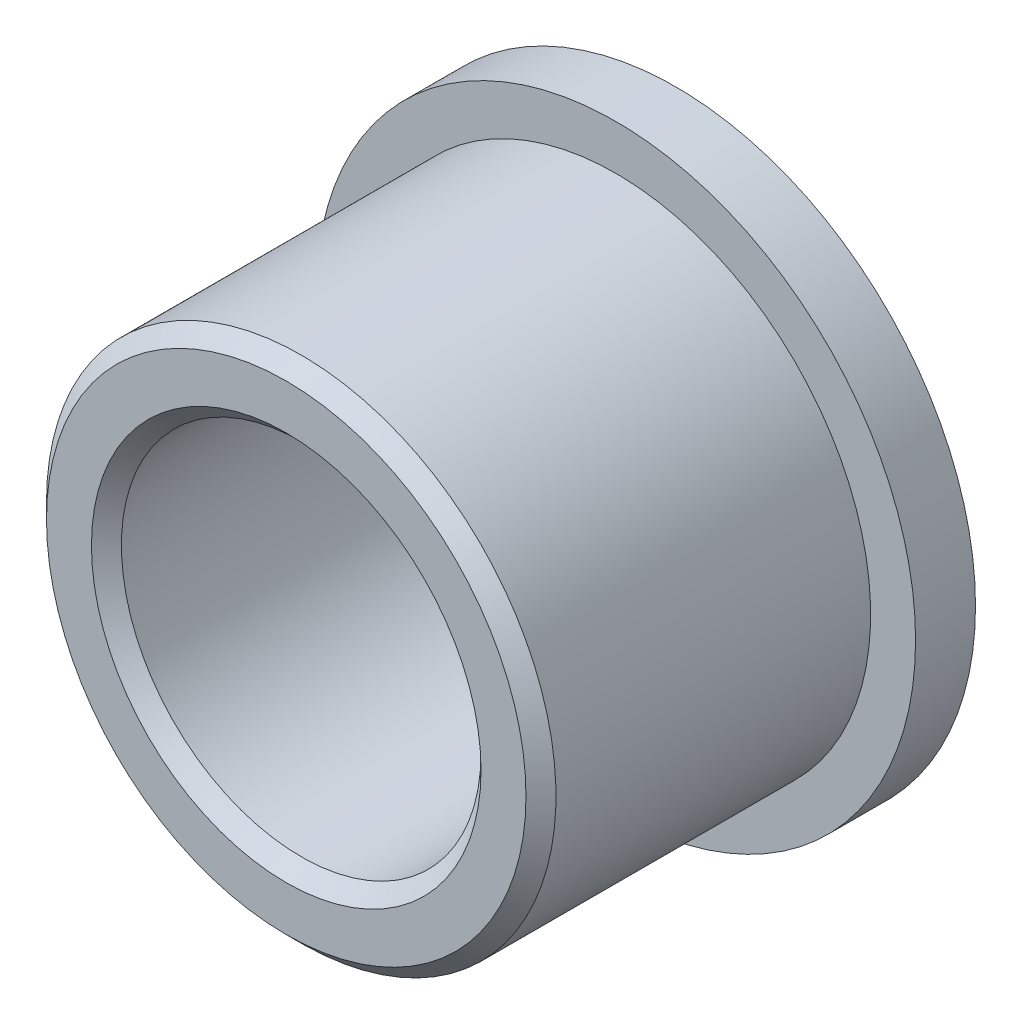
ISO-10303-21;
HEADER;
FILE_DESCRIPTION(('STEP AP214'),'2;1');
FILE_NAME('part.step','',(''),(''),'','','');
FILE_SCHEMA(('AUTOMOTIVE_DESIGN { 1 0 10303 214 1 1 1 1 }'));
ENDSEC;
DATA;
#1=APPLICATION_CONTEXT('core data for automotive mechanical design processes');
#2=APPLICATION_PROTOCOL_DEFINITION('international standard','automotive_design',2000,#1);
#3=PRODUCT_CONTEXT('',#1,'mechanical');
#4=PRODUCT('Part','Part','',(#3));
#5=PRODUCT_RELATED_PRODUCT_CATEGORY('part','',(#4));
#6=PRODUCT_DEFINITION_FORMATION('','',#4);
#7=PRODUCT_DEFINITION_CONTEXT('part definition',#1,'design');
#8=PRODUCT_DEFINITION('design','',#6,#7);
#9=PRODUCT_DEFINITION_SHAPE('','',#8);
#10=(LENGTH_UNIT() NAMED_UNIT(*) SI_UNIT(.MILLI.,.METRE.));
#11=(NAMED_UNIT(*) PLANE_ANGLE_UNIT() SI_UNIT($,.RADIAN.));
#12=(NAMED_UNIT(*) SI_UNIT($,.STERADIAN.) SOLID_ANGLE_UNIT());
#13=UNCERTAINTY_MEASURE_WITH_UNIT(LENGTH_MEASURE(1.E-05),#10,'distance_accuracy_value','');
#14=(GEOMETRIC_REPRESENTATION_CONTEXT(3) GLOBAL_UNCERTAINTY_ASSIGNED_CONTEXT((#13)) GLOBAL_UNIT_ASSIGNED_CONTEXT((#10,
#11,#12)) REPRESENTATION_CONTEXT('',''));
#15=CARTESIAN_POINT('',(0.,0.,0.));
#16=DIRECTION('',(0.,0.,1.));
#17=DIRECTION('',(1.,0.,0.));
#18=AXIS2_PLACEMENT_3D('',#15,#16,#17);
#19=CARTESIAN_POINT('',(0.,0.,2.));
#20=DIRECTION('',(0.,0.,-1.));
#21=DIRECTION('',(-1.,0.,0.));
#22=AXIS2_PLACEMENT_3D('',#19,#20,#21);
#23=CYLINDRICAL_SURFACE('',#22,10.);
#24=CARTESIAN_POINT('',(0.,0.,2.));
#25=DIRECTION('',(0.,0.,1.));
#26=DIRECTION('',(1.,0.,0.));
#27=AXIS2_PLACEMENT_3D('',#24,#25,#26);
#28=CIRCLE('',#27,10.);
#29=CARTESIAN_POINT('',(10.,0.,2.));
#30=VERTEX_POINT('',#29);
#31=EDGE_CURVE('E80',#30,#30,#28,.T.);
#32=ORIENTED_EDGE('',*,*,#31,.F.);
#33=EDGE_LOOP('',(#32));
#34=FACE_BOUND('',#33,.T.);
#35=CARTESIAN_POINT('',(0.,0.,0.));
#36=DIRECTION('',(0.,0.,1.));
#37=DIRECTION('',(1.,0.,0.));
#38=AXIS2_PLACEMENT_3D('',#35,#36,#37);
#39=CIRCLE('',#38,10.);
#40=CARTESIAN_POINT('',(10.,0.,0.));
#41=VERTEX_POINT('',#40);
#42=EDGE_CURVE('E81',#41,#41,#39,.T.);
#43=ORIENTED_EDGE('',*,*,#42,.T.);
#44=EDGE_LOOP('',(#43));
#45=FACE_BOUND('',#44,.T.);
#46=ADVANCED_FACE('F47',(#34,#45),#23,.T.);
#47=CARTESIAN_POINT('',(0.,0.,2.));
#48=DIRECTION('',(0.,0.,1.));
#49=DIRECTION('',(1.,0.,0.));
#50=AXIS2_PLACEMENT_3D('',#47,#48,#49);
#51=PLANE('',#50);
#52=CARTESIAN_POINT('',(0.,0.,2.));
#53=DIRECTION('',(0.,0.,1.));
#54=DIRECTION('',(1.,0.,0.));
#55=AXIS2_PLACEMENT_3D('',#52,#53,#54);
#56=CIRCLE('',#55,8.5);
#57=CARTESIAN_POINT('',(-8.5,0.,2.));
#58=VERTEX_POINT('',#57);
#59=EDGE_CURVE('E85',#58,#58,#56,.F.);
#60=ORIENTED_EDGE('',*,*,#59,.T.);
#61=EDGE_LOOP('',(#60));
#62=FACE_BOUND('',#61,.T.);
#63=ORIENTED_EDGE('',*,*,#31,.T.);
#64=EDGE_LOOP('',(#63));
#65=FACE_BOUND('',#64,.T.);
#66=ADVANCED_FACE('F93',(#62,#65),#51,.T.);
#67=CARTESIAN_POINT('',(0.,0.,0.));
#68=DIRECTION('',(0.,0.,1.));
#69=DIRECTION('',(1.,0.,0.));
#70=AXIS2_PLACEMENT_3D('',#67,#68,#69);
#71=PLANE('',#70);
#72=CARTESIAN_POINT('',(0.,0.,0.));
#73=DIRECTION('',(0.,0.,1.));
#74=DIRECTION('',(1.,0.,0.));
#75=AXIS2_PLACEMENT_3D('',#72,#73,#74);
#76=CIRCLE('',#75,6.49999999999999);
#77=CARTESIAN_POINT('',(6.49999999999999,0.,0.));
#78=VERTEX_POINT('',#77);
#79=EDGE_CURVE('E56',#78,#78,#76,.T.);
#80=ORIENTED_EDGE('',*,*,#79,.T.);
#81=EDGE_LOOP('',(#80));
#82=FACE_BOUND('',#81,.T.);
#83=ORIENTED_EDGE('',*,*,#42,.F.);
#84=EDGE_LOOP('',(#83));
#85=FACE_BOUND('',#84,.T.);
#86=ADVANCED_FACE('F99',(#82,#85),#71,.F.);
#87=CARTESIAN_POINT('',(0.,0.,13.));
#88=DIRECTION('',(0.,0.,-1.));
#89=DIRECTION('',(-1.,0.,0.));
#90=AXIS2_PLACEMENT_3D('',#87,#88,#89);
#91=CYLINDRICAL_SURFACE('',#90,8.5);
#92=CARTESIAN_POINT('',(0.,0.,12.5));
#93=DIRECTION('',(0.,0.,1.));
#94=DIRECTION('',(1.,0.,0.));
#95=AXIS2_PLACEMENT_3D('',#92,#93,#94);
#96=CIRCLE('',#95,8.5);
#97=CARTESIAN_POINT('',(-8.5,0.,12.5));
#98=VERTEX_POINT('',#97);
#99=EDGE_CURVE('E10',#98,#98,#96,.F.);
#100=CARTESIAN_POINT('',(-8.5,0.,12.5));
#101=CARTESIAN_POINT('',(-8.5,0.,12.390625));
#102=CARTESIAN_POINT('',(-8.5,0.,12.28125));
#103=CARTESIAN_POINT('',(-8.5,0.,12.0625));
#104=CARTESIAN_POINT('',(-8.5,0.,11.953125));
#105=CARTESIAN_POINT('',(-8.5,0.,11.734375));
#106=CARTESIAN_POINT('',(-8.5,0.,11.625));
#107=CARTESIAN_POINT('',(-8.5,0.,11.40625));
#108=CARTESIAN_POINT('',(-8.5,0.,11.296875));
#109=CARTESIAN_POINT('',(-8.5,0.,11.078125));
#110=CARTESIAN_POINT('',(-8.5,0.,10.96875));
#111=CARTESIAN_POINT('',(-8.5,0.,10.75));
#112=CARTESIAN_POINT('',(-8.5,0.,10.640625));
#113=CARTESIAN_POINT('',(-8.5,0.,10.421875));
#114=CARTESIAN_POINT('',(-8.5,0.,10.3125));
#115=CARTESIAN_POINT('',(-8.5,0.,10.09375));
#116=CARTESIAN_POINT('',(-8.5,0.,9.98437500000001));
#117=CARTESIAN_POINT('',(-8.5,0.,9.76562500000001));
#118=CARTESIAN_POINT('',(-8.5,0.,9.65625000000001));
#119=CARTESIAN_POINT('',(-8.5,0.,9.43750000000001));
#120=CARTESIAN_POINT('',(-8.5,0.,9.32812500000001));
#121=CARTESIAN_POINT('',(-8.5,0.,9.10937500000001));
#122=CARTESIAN_POINT('',(-8.5,0.,9.00000000000001));
#123=CARTESIAN_POINT('',(-8.5,0.,8.78125000000001));
#124=CARTESIAN_POINT('',(-8.5,0.,8.67187500000001));
#125=CARTESIAN_POINT('',(-8.5,0.,8.45312500000001));
#126=CARTESIAN_POINT('',(-8.5,0.,8.34375000000001));
#127=CARTESIAN_POINT('',(-8.5,0.,8.12500000000001));
#128=CARTESIAN_POINT('',(-8.5,0.,8.01562500000001));
#129=CARTESIAN_POINT('',(-8.5,0.,7.79687500000001));
#130=CARTESIAN_POINT('',(-8.5,0.,7.68750000000001));
#131=CARTESIAN_POINT('',(-8.5,0.,7.46875000000001));
#132=CARTESIAN_POINT('',(-8.5,0.,7.35937500000001));
#133=CARTESIAN_POINT('',(-8.5,0.,7.14062500000001));
#134=CARTESIAN_POINT('',(-8.5,0.,7.03125000000001));
#135=CARTESIAN_POINT('',(-8.5,0.,6.81250000000001));
#136=CARTESIAN_POINT('',(-8.5,0.,6.70312500000001));
#137=CARTESIAN_POINT('',(-8.5,0.,6.48437500000001));
#138=CARTESIAN_POINT('',(-8.5,0.,6.375));
#139=CARTESIAN_POINT('',(-8.5,0.,6.15625));
#140=CARTESIAN_POINT('',(-8.5,0.,6.046875));
#141=CARTESIAN_POINT('',(-8.5,0.,5.828125));
#142=CARTESIAN_POINT('',(-8.5,0.,5.71875));
#143=CARTESIAN_POINT('',(-8.5,0.,5.5));
#144=CARTESIAN_POINT('',(-8.5,0.,5.390625));
#145=CARTESIAN_POINT('',(-8.5,0.,5.171875));
#146=CARTESIAN_POINT('',(-8.5,0.,5.0625));
#147=CARTESIAN_POINT('',(-8.5,0.,4.84375));
#148=CARTESIAN_POINT('',(-8.5,0.,4.734375));
#149=CARTESIAN_POINT('',(-8.5,0.,4.515625));
#150=CARTESIAN_POINT('',(-8.5,0.,4.40625));
#151=CARTESIAN_POINT('',(-8.5,0.,4.1875));
#152=CARTESIAN_POINT('',(-8.5,0.,4.078125));
#153=CARTESIAN_POINT('',(-8.5,0.,3.859375));
#154=CARTESIAN_POINT('',(-8.5,0.,3.75));
#155=CARTESIAN_POINT('',(-8.5,0.,3.53125));
#156=CARTESIAN_POINT('',(-8.5,0.,3.421875));
#157=CARTESIAN_POINT('',(-8.5,0.,3.203125));
#158=CARTESIAN_POINT('',(-8.5,0.,3.09375));
#159=CARTESIAN_POINT('',(-8.5,0.,2.875));
#160=CARTESIAN_POINT('',(-8.5,0.,2.765625));
#161=CARTESIAN_POINT('',(-8.5,0.,2.546875));
#162=CARTESIAN_POINT('',(-8.5,0.,2.4375));
#163=CARTESIAN_POINT('',(-8.5,0.,2.21875));
#164=CARTESIAN_POINT('',(-8.5,0.,2.109375));
#165=CARTESIAN_POINT('',(-8.5,0.,2.));
#166=B_SPLINE_CURVE_WITH_KNOTS('',3,(#100,#101,#102,#103,#104,#105,#106,#107,#108,#109,#110,
#111,#112,#113,#114,#115,#116,#117,#118,#119,#120,#121,#122,#123,#124,#125,#126,#127,#128,#129,
#130,#131,#132,#133,#134,#135,#136,#137,#138,#139,#140,#141,#142,#143,#144,#145,#146,#147,#148,
#149,#150,#151,#152,#153,#154,#155,#156,#157,#158,#159,#160,#161,#162,#163,#164,#165),
.UNSPECIFIED.,.F.,.F.,(4,2,2,2,2,2,2,2,2,2,2,2,2,2,2,2,2,2,2,2,2,2,2,2,2,2,2,2,2,2,2,2,4),(0.,
0.328125,0.656250000000001,0.984375000000001,1.3125,1.640625,1.96875,2.296875,2.625,2.953125,
3.28125,3.609375,3.93750000000001,4.265625,4.59375000000001,4.92187500000001,5.25000000000001,
5.57812500000001,5.90625000000001,6.23437500000001,6.56250000000001,6.89062500000001,
7.21875000000001,7.54687500000001,7.87500000000001,8.20312500000001,8.53125000000001,
8.85937500000001,9.18750000000001,9.51562500000001,9.84375000000001,10.171875,10.5),.UNSPECIFIED.);
#167=EDGE_CURVE('BSEAM96',#98,#58,#166,.T.);
#168=ORIENTED_EDGE('',*,*,#99,.T.);
#169=ORIENTED_EDGE('',*,*,#59,.F.);
#170=ORIENTED_EDGE('',*,*,#167,.T.);
#171=ORIENTED_EDGE('',*,*,#167,.F.);
#172=EDGE_LOOP('',(#168,#170,#169,#171));
#173=FACE_BOUND('',#172,.T.);
#174=ADVANCED_FACE('F96',(#173),#91,.T.);
#175=CARTESIAN_POINT('',(0.,0.,13.));
#176=DIRECTION('',(0.,0.,1.));
#177=DIRECTION('',(1.,0.,0.));
#178=AXIS2_PLACEMENT_3D('',#175,#176,#177);
#179=PLANE('',#178);
#180=CARTESIAN_POINT('',(0.,0.,13.));
#181=DIRECTION('',(0.,0.,1.));
#182=DIRECTION('',(1.,0.,0.));
#183=AXIS2_PLACEMENT_3D('',#180,#181,#182);
#184=CIRCLE('',#183,6.50000000000003);
#185=CARTESIAN_POINT('',(6.50000000000003,0.,13.));
#186=VERTEX_POINT('',#185);
#187=EDGE_CURVE('E61',#186,#186,#184,.F.);
#188=ORIENTED_EDGE('',*,*,#187,.T.);
#189=EDGE_LOOP('',(#188));
#190=FACE_BOUND('',#189,.T.);
#191=CARTESIAN_POINT('',(0.,0.,13.));
#192=DIRECTION('',(0.,0.,1.));
#193=DIRECTION('',(1.,0.,0.));
#194=AXIS2_PLACEMENT_3D('',#191,#192,#193);
#195=CIRCLE('',#194,8.00000000000002);
#196=CARTESIAN_POINT('',(8.00000000000002,0.,13.));
#197=VERTEX_POINT('',#196);
#198=EDGE_CURVE('E66',#197,#197,#195,.T.);
#199=ORIENTED_EDGE('',*,*,#198,.T.);
#200=EDGE_LOOP('',(#199));
#201=FACE_BOUND('',#200,.T.);
#202=ADVANCED_FACE('F98',(#190,#201),#179,.T.);
#203=CARTESIAN_POINT('',(0.,0.,0.));
#204=DIRECTION('',(0.,0.,1.));
#205=DIRECTION('',(1.,0.,0.));
#206=AXIS2_PLACEMENT_3D('',#203,#204,#205);
#207=CYLINDRICAL_SURFACE('',#206,6.);
#208=CARTESIAN_POINT('',(0.,0.,12.5));
#209=DIRECTION('',(0.,0.,1.));
#210=DIRECTION('',(1.,0.,0.));
#211=AXIS2_PLACEMENT_3D('',#208,#209,#210);
#212=CIRCLE('',#211,6.);
#213=CARTESIAN_POINT('',(6.,0.,12.5));
#214=VERTEX_POINT('',#213);
#215=EDGE_CURVE('E72',#214,#214,#212,.T.);
#216=CARTESIAN_POINT('',(0.,0.,0.499999999999993));
#217=DIRECTION('',(0.,0.,1.));
#218=DIRECTION('',(1.,0.,0.));
#219=AXIS2_PLACEMENT_3D('',#216,#217,#218);
#220=CIRCLE('',#219,6.);
#221=CARTESIAN_POINT('',(6.,0.,0.499999999999993));
#222=VERTEX_POINT('',#221);
#223=EDGE_CURVE('E76',#222,#222,#220,.F.);
#224=CARTESIAN_POINT('',(6.,0.,12.5));
#225=CARTESIAN_POINT('',(6.,0.,12.375));
#226=CARTESIAN_POINT('',(6.,0.,12.25));
#227=CARTESIAN_POINT('',(6.,0.,12.));
#228=CARTESIAN_POINT('',(6.,0.,11.875));
#229=CARTESIAN_POINT('',(6.,0.,11.625));
#230=CARTESIAN_POINT('',(6.,0.,11.5));
#231=CARTESIAN_POINT('',(6.,0.,11.25));
#232=CARTESIAN_POINT('',(6.,0.,11.125));
#233=CARTESIAN_POINT('',(6.,0.,10.875));
#234=CARTESIAN_POINT('',(6.,0.,10.75));
#235=CARTESIAN_POINT('',(6.,0.,10.5));
#236=CARTESIAN_POINT('',(6.,0.,10.375));
#237=CARTESIAN_POINT('',(6.,0.,10.125));
#238=CARTESIAN_POINT('',(6.,0.,9.99999999999998));
#239=CARTESIAN_POINT('',(6.,0.,9.74999999999998));
#240=CARTESIAN_POINT('',(6.,0.,9.62499999999998));
#241=CARTESIAN_POINT('',(6.,0.,9.37499999999998));
#242=CARTESIAN_POINT('',(6.,0.,9.24999999999998));
#243=CARTESIAN_POINT('',(6.,0.,8.99999999999998));
#244=CARTESIAN_POINT('',(6.,0.,8.87499999999998));
#245=CARTESIAN_POINT('',(6.,0.,8.62499999999998));
#246=CARTESIAN_POINT('',(6.,0.,8.49999999999998));
#247=CARTESIAN_POINT('',(6.,0.,8.24999999999998));
#248=CARTESIAN_POINT('',(6.,0.,8.12499999999998));
#249=CARTESIAN_POINT('',(6.,0.,7.87499999999998));
#250=CARTESIAN_POINT('',(6.,0.,7.74999999999998));
#251=CARTESIAN_POINT('',(6.,0.,7.49999999999998));
#252=CARTESIAN_POINT('',(6.,0.,7.37499999999998));
#253=CARTESIAN_POINT('',(6.,0.,7.12499999999998));
#254=CARTESIAN_POINT('',(6.,0.,6.99999999999998));
#255=CARTESIAN_POINT('',(6.,0.,6.74999999999998));
#256=CARTESIAN_POINT('',(6.,0.,6.62499999999998));
#257=CARTESIAN_POINT('',(6.,0.,6.37499999999998));
#258=CARTESIAN_POINT('',(6.,0.,6.24999999999998));
#259=CARTESIAN_POINT('',(6.,0.,5.99999999999998));
#260=CARTESIAN_POINT('',(6.,0.,5.87499999999998));
#261=CARTESIAN_POINT('',(6.,0.,5.62499999999998));
#262=CARTESIAN_POINT('',(6.,0.,5.49999999999999));
#263=CARTESIAN_POINT('',(6.,0.,5.24999999999999));
#264=CARTESIAN_POINT('',(6.,0.,5.12499999999999));
#265=CARTESIAN_POINT('',(6.,0.,4.87499999999999));
#266=CARTESIAN_POINT('',(6.,0.,4.74999999999999));
#267=CARTESIAN_POINT('',(6.,0.,4.49999999999999));
#268=CARTESIAN_POINT('',(6.,0.,4.37499999999999));
#269=CARTESIAN_POINT('',(6.,0.,4.12499999999999));
#270=CARTESIAN_POINT('',(6.,0.,3.99999999999999));
#271=CARTESIAN_POINT('',(6.,0.,3.74999999999999));
#272=CARTESIAN_POINT('',(6.,0.,3.62499999999999));
#273=CARTESIAN_POINT('',(6.,0.,3.37499999999999));
#274=CARTESIAN_POINT('',(6.,0.,3.24999999999999));
#275=CARTESIAN_POINT('',(6.,0.,2.99999999999999));
#276=CARTESIAN_POINT('',(6.,0.,2.87499999999999));
#277=CARTESIAN_POINT('',(6.,0.,2.62499999999999));
#278=CARTESIAN_POINT('',(6.,0.,2.49999999999999));
#279=CARTESIAN_POINT('',(6.,0.,2.24999999999999));
#280=CARTESIAN_POINT('',(6.,0.,2.12499999999999));
#281=CARTESIAN_POINT('',(6.,0.,1.87499999999999));
#282=CARTESIAN_POINT('',(6.,0.,1.74999999999999));
#283=CARTESIAN_POINT('',(6.,0.,1.49999999999999));
#284=CARTESIAN_POINT('',(6.,0.,1.37499999999999));
#285=CARTESIAN_POINT('',(6.,0.,1.12499999999999));
#286=CARTESIAN_POINT('',(6.,0.,0.999999999999993));
#287=CARTESIAN_POINT('',(6.,0.,0.749999999999994));
#288=CARTESIAN_POINT('',(6.,0.,0.624999999999994));
#289=CARTESIAN_POINT('',(6.,0.,0.499999999999993));
#290=B_SPLINE_CURVE_WITH_KNOTS('',3,(#224,#225,#226,#227,#228,#229,#230,#231,#232,#233,#234,
#235,#236,#237,#238,#239,#240,#241,#242,#243,#244,#245,#246,#247,#248,#249,#250,#251,#252,#253,
#254,#255,#256,#257,#258,#259,#260,#261,#262,#263,#264,#265,#266,#267,#268,#269,#270,#271,#272,
#273,#274,#275,#276,#277,#278,#279,#280,#281,#282,#283,#284,#285,#286,#287,#288,#289),
.UNSPECIFIED.,.F.,.F.,(4,2,2,2,2,2,2,2,2,2,2,2,2,2,2,2,2,2,2,2,2,2,2,2,2,2,2,2,2,2,2,2,4),(0.,
0.375,0.749999999999999,1.125,1.5,1.875,2.25,2.625,3.,3.375,3.74999999999999,4.12499999999999,
4.49999999999999,4.87499999999999,5.24999999999999,5.62499999999999,5.99999999999999,
6.37499999999999,6.74999999999999,7.12499999999999,7.49999999999999,7.87499999999999,
8.24999999999999,8.62499999999999,8.99999999999999,9.37499999999999,9.74999999999999,10.125,
10.5,10.875,11.25,11.625,12.),.UNSPECIFIED.);
#291=EDGE_CURVE('BSEAM105',#214,#222,#290,.T.);
#292=ORIENTED_EDGE('',*,*,#215,.T.);
#293=ORIENTED_EDGE('',*,*,#223,.T.);
#294=ORIENTED_EDGE('',*,*,#291,.T.);
#295=ORIENTED_EDGE('',*,*,#291,.F.);
#296=EDGE_LOOP('',(#292,#294,#293,#295));
#297=FACE_BOUND('',#296,.T.);
#298=ADVANCED_FACE('F105',(#297),#207,.F.);
#299=CARTESIAN_POINT('',(0.,0.,12.5));
#300=DIRECTION('',(0.,0.,1.));
#301=DIRECTION('',(1.,0.,0.));
#302=AXIS2_PLACEMENT_3D('',#299,#300,#301);
#303=CONICAL_SURFACE('',#302,6.,0.785398163397452);
#304=ORIENTED_EDGE('',*,*,#187,.F.);
#305=EDGE_LOOP('',(#304));
#306=FACE_BOUND('',#305,.T.);
#307=ORIENTED_EDGE('',*,*,#215,.F.);
#308=EDGE_LOOP('',(#307));
#309=FACE_BOUND('',#308,.T.);
#310=ADVANCED_FACE('F120',(#306,#309),#303,.F.);
#311=CARTESIAN_POINT('',(0.,0.,0.));
#312=DIRECTION('',(0.,0.,-1.));
#313=DIRECTION('',(-1.,0.,0.));
#314=AXIS2_PLACEMENT_3D('',#311,#312,#313);
#315=CONICAL_SURFACE('',#314,6.49999999999999,0.785398163397449);
#316=ORIENTED_EDGE('',*,*,#223,.F.);
#317=EDGE_LOOP('',(#316));
#318=FACE_BOUND('',#317,.T.);
#319=ORIENTED_EDGE('',*,*,#79,.F.);
#320=EDGE_LOOP('',(#319));
#321=FACE_BOUND('',#320,.T.);
#322=ADVANCED_FACE('F125',(#318,#321),#315,.F.);
#323=CARTESIAN_POINT('',(0.,0.,13.));
#324=DIRECTION('',(0.,0.,-1.));
#325=DIRECTION('',(-1.,0.,0.));
#326=AXIS2_PLACEMENT_3D('',#323,#324,#325);
#327=CONICAL_SURFACE('',#326,8.00000000000002,0.785398163397448);
#328=ORIENTED_EDGE('',*,*,#99,.F.);
#329=EDGE_LOOP('',(#328));
#330=FACE_BOUND('',#329,.T.);
#331=ORIENTED_EDGE('',*,*,#198,.F.);
#332=EDGE_LOOP('',(#331));
#333=FACE_BOUND('',#332,.T.);
#334=ADVANCED_FACE('F50',(#330,#333),#327,.T.);
#335=CLOSED_SHELL('',(#46,#66,#86,#174,#202,#298,#310,#322,#334));
#336=MANIFOLD_SOLID_BREP('B2',#335);
#337=ADVANCED_BREP_SHAPE_REPRESENTATION('',(#18,#336),#14);
#338=SHAPE_DEFINITION_REPRESENTATION(#9,#337);
ENDSEC;
END-ISO-10303-21;
